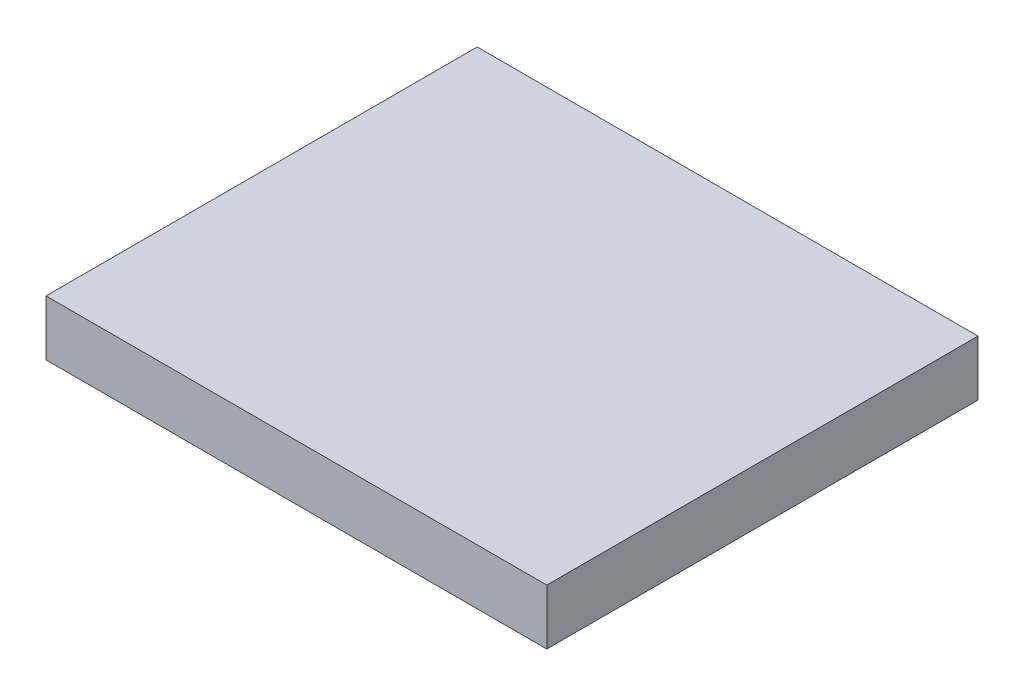
ISO-10303-21;
HEADER;
FILE_DESCRIPTION(('STEP AP214'),'2;1');
FILE_NAME('part.step','',(''),(''),'','','');
FILE_SCHEMA(('AUTOMOTIVE_DESIGN { 1 0 10303 214 1 1 1 1 }'));
ENDSEC;
DATA;
#1=APPLICATION_CONTEXT('core data for automotive mechanical design processes');
#2=APPLICATION_PROTOCOL_DEFINITION('international standard','automotive_design',2000,#1);
#3=PRODUCT_CONTEXT('',#1,'mechanical');
#4=PRODUCT('Part','Part','',(#3));
#5=PRODUCT_RELATED_PRODUCT_CATEGORY('part','',(#4));
#6=PRODUCT_DEFINITION_FORMATION('','',#4);
#7=PRODUCT_DEFINITION_CONTEXT('part definition',#1,'design');
#8=PRODUCT_DEFINITION('design','',#6,#7);
#9=PRODUCT_DEFINITION_SHAPE('','',#8);
#10=(LENGTH_UNIT() NAMED_UNIT(*) SI_UNIT(.MILLI.,.METRE.));
#11=(NAMED_UNIT(*) PLANE_ANGLE_UNIT() SI_UNIT($,.RADIAN.));
#12=(NAMED_UNIT(*) SI_UNIT($,.STERADIAN.) SOLID_ANGLE_UNIT());
#13=UNCERTAINTY_MEASURE_WITH_UNIT(LENGTH_MEASURE(1.E-05),#10,'distance_accuracy_value','');
#14=(GEOMETRIC_REPRESENTATION_CONTEXT(3) GLOBAL_UNCERTAINTY_ASSIGNED_CONTEXT((#13)) GLOBAL_UNIT_ASSIGNED_CONTEXT((#10,
#11,#12)) REPRESENTATION_CONTEXT('',''));
#15=CARTESIAN_POINT('',(0.,0.,0.));
#16=DIRECTION('',(0.,0.,1.));
#17=DIRECTION('',(1.,0.,0.));
#18=AXIS2_PLACEMENT_3D('',#15,#16,#17);
#19=CARTESIAN_POINT('',(-26.199029290648,5.874618009437,0.));
#20=DIRECTION('',(1.,0.,0.));
#21=DIRECTION('',(0.,1.,0.));
#22=AXIS2_PLACEMENT_3D('',#19,#20,#21);
#23=PLANE('',#22);
#24=DIRECTION('',(0.,-1.,0.));
#25=VECTOR('',#24,1.);
#26=CARTESIAN_POINT('',(-26.199029290648,5.887465362914,0.));
#27=LINE('',#26,#25);
#28=CARTESIAN_POINT('',(-26.199029290648,5.887465362914,0.));
#29=VERTEX_POINT('',#28);
#30=CARTESIAN_POINT('',(-26.199029290648,5.874618009437,0.));
#31=VERTEX_POINT('',#30);
#32=EDGE_CURVE('E11',#29,#31,#27,.T.);
#33=ORIENTED_EDGE('',*,*,#32,.F.);
#34=DIRECTION('',(0.,0.,1.));
#35=VECTOR('',#34,1.);
#36=CARTESIAN_POINT('',(-26.199029290648,5.887465362914,0.));
#37=LINE('',#36,#35);
#38=CARTESIAN_POINT('',(-26.199029290648,5.887465362914,0.1));
#39=VERTEX_POINT('',#38);
#40=EDGE_CURVE('E24',#29,#39,#37,.T.);
#41=ORIENTED_EDGE('',*,*,#40,.T.);
#42=DIRECTION('',(0.,1.,0.));
#43=VECTOR('',#42,1.);
#44=CARTESIAN_POINT('',(-26.199029290648,5.887465362914,0.1));
#45=LINE('',#44,#43);
#46=CARTESIAN_POINT('',(-26.199029290648,5.874618009437,0.1));
#47=VERTEX_POINT('',#46);
#48=EDGE_CURVE('E75',#47,#39,#45,.T.);
#49=ORIENTED_EDGE('',*,*,#48,.F.);
#50=DIRECTION('',(0.,0.,1.));
#51=VECTOR('',#50,1.);
#52=CARTESIAN_POINT('',(-26.199029290648,5.874618009437,0.));
#53=LINE('',#52,#51);
#54=EDGE_CURVE('E85',#31,#47,#53,.T.);
#55=ORIENTED_EDGE('',*,*,#54,.F.);
#56=EDGE_LOOP('',(#33,#41,#49,#55));
#57=FACE_BOUND('',#56,.T.);
#58=ADVANCED_FACE('F17',(#57),#23,.T.);
#59=CARTESIAN_POINT('',(-26.315170054864,5.874618009437,0.));
#60=DIRECTION('',(0.,-1.,0.));
#61=DIRECTION('',(1.,0.,0.));
#62=AXIS2_PLACEMENT_3D('',#59,#60,#61);
#63=PLANE('',#62);
#64=DIRECTION('',(-1.,0.,0.));
#65=VECTOR('',#64,1.);
#66=CARTESIAN_POINT('',(-26.199029290648,5.874618009437,0.));
#67=LINE('',#66,#65);
#68=CARTESIAN_POINT('',(-26.315170054864,5.874618009437,0.));
#69=VERTEX_POINT('',#68);
#70=EDGE_CURVE('E83',#31,#69,#67,.T.);
#71=ORIENTED_EDGE('',*,*,#70,.F.);
#72=ORIENTED_EDGE('',*,*,#54,.T.);
#73=DIRECTION('',(1.,0.,0.));
#74=VECTOR('',#73,1.);
#75=CARTESIAN_POINT('',(-26.199029290648,5.874618009437,0.1));
#76=LINE('',#75,#74);
#77=CARTESIAN_POINT('',(-26.315170054864,5.874618009437,0.1));
#78=VERTEX_POINT('',#77);
#79=EDGE_CURVE('E81',#78,#47,#76,.T.);
#80=ORIENTED_EDGE('',*,*,#79,.F.);
#81=DIRECTION('',(0.,0.,1.));
#82=VECTOR('',#81,1.);
#83=CARTESIAN_POINT('',(-26.315170054864,5.874618009437,0.));
#84=LINE('',#83,#82);
#85=EDGE_CURVE('E61',#69,#78,#84,.T.);
#86=ORIENTED_EDGE('',*,*,#85,.F.);
#87=EDGE_LOOP('',(#71,#72,#80,#86));
#88=FACE_BOUND('',#87,.T.);
#89=ADVANCED_FACE('F91',(#88),#63,.T.);
#90=CARTESIAN_POINT('',(-26.315170054864,5.887465362914,0.));
#91=DIRECTION('',(-1.,0.,0.));
#92=DIRECTION('',(0.,-1.,0.));
#93=AXIS2_PLACEMENT_3D('',#90,#91,#92);
#94=PLANE('',#93);
#95=DIRECTION('',(0.,1.,0.));
#96=VECTOR('',#95,1.);
#97=CARTESIAN_POINT('',(-26.315170054864,5.874618009437,0.));
#98=LINE('',#97,#96);
#99=CARTESIAN_POINT('',(-26.315170054864,5.887465362914,0.));
#100=VERTEX_POINT('',#99);
#101=EDGE_CURVE('E65',#69,#100,#98,.T.);
#102=ORIENTED_EDGE('',*,*,#101,.F.);
#103=ORIENTED_EDGE('',*,*,#85,.T.);
#104=DIRECTION('',(0.,-1.,0.));
#105=VECTOR('',#104,1.);
#106=CARTESIAN_POINT('',(-26.315170054864,5.874618009437,0.1));
#107=LINE('',#106,#105);
#108=CARTESIAN_POINT('',(-26.315170054864,5.887465362914,0.1));
#109=VERTEX_POINT('',#108);
#110=EDGE_CURVE('E54',#109,#78,#107,.T.);
#111=ORIENTED_EDGE('',*,*,#110,.F.);
#112=DIRECTION('',(0.,0.,1.));
#113=VECTOR('',#112,1.);
#114=CARTESIAN_POINT('',(-26.315170054864,5.887465362914,0.));
#115=LINE('',#114,#113);
#116=EDGE_CURVE('E58',#100,#109,#115,.T.);
#117=ORIENTED_EDGE('',*,*,#116,.F.);
#118=EDGE_LOOP('',(#102,#103,#111,#117));
#119=FACE_BOUND('',#118,.T.);
#120=ADVANCED_FACE('F57',(#119),#94,.T.);
#121=CARTESIAN_POINT('',(-26.199029290648,5.887465362914,0.));
#122=DIRECTION('',(0.,1.,0.));
#123=DIRECTION('',(-1.,0.,0.));
#124=AXIS2_PLACEMENT_3D('',#121,#122,#123);
#125=PLANE('',#124);
#126=DIRECTION('',(1.,0.,0.));
#127=VECTOR('',#126,1.);
#128=CARTESIAN_POINT('',(-26.315170054864,5.887465362914,0.));
#129=LINE('',#128,#127);
#130=EDGE_CURVE('E71',#100,#29,#129,.T.);
#131=ORIENTED_EDGE('',*,*,#130,.F.);
#132=ORIENTED_EDGE('',*,*,#116,.T.);
#133=DIRECTION('',(-1.,0.,0.));
#134=VECTOR('',#133,1.);
#135=CARTESIAN_POINT('',(-26.315170054864,5.887465362914,0.1));
#136=LINE('',#135,#134);
#137=EDGE_CURVE('E70',#39,#109,#136,.T.);
#138=ORIENTED_EDGE('',*,*,#137,.F.);
#139=ORIENTED_EDGE('',*,*,#40,.F.);
#140=EDGE_LOOP('',(#131,#132,#138,#139));
#141=FACE_BOUND('',#140,.T.);
#142=ADVANCED_FACE('F69',(#141),#125,.T.);
#143=CARTESIAN_POINT('',(-26.257099672756,5.881041686176,0.));
#144=DIRECTION('',(0.,0.,1.));
#145=DIRECTION('',(1.,0.,0.));
#146=AXIS2_PLACEMENT_3D('',#143,#144,#145);
#147=PLANE('',#146);
#148=ORIENTED_EDGE('',*,*,#130,.T.);
#149=ORIENTED_EDGE('',*,*,#32,.T.);
#150=ORIENTED_EDGE('',*,*,#70,.T.);
#151=ORIENTED_EDGE('',*,*,#101,.T.);
#152=EDGE_LOOP('',(#148,#149,#150,#151));
#153=FACE_BOUND('',#152,.T.);
#154=ADVANCED_FACE('F88',(#153),#147,.F.);
#155=CARTESIAN_POINT('',(-26.257099672756,5.881041686176,0.1));
#156=DIRECTION('',(0.,0.,1.));
#157=DIRECTION('',(1.,0.,0.));
#158=AXIS2_PLACEMENT_3D('',#155,#156,#157);
#159=PLANE('',#158);
#160=ORIENTED_EDGE('',*,*,#137,.T.);
#161=ORIENTED_EDGE('',*,*,#110,.T.);
#162=ORIENTED_EDGE('',*,*,#79,.T.);
#163=ORIENTED_EDGE('',*,*,#48,.T.);
#164=EDGE_LOOP('',(#160,#161,#162,#163));
#165=FACE_BOUND('',#164,.T.);
#166=ADVANCED_FACE('F74',(#165),#159,.T.);
#167=CLOSED_SHELL('',(#58,#89,#120,#142,#154,#166));
#168=MANIFOLD_SOLID_BREP('B1',#167);
#169=ADVANCED_BREP_SHAPE_REPRESENTATION('',(#18,#168),#14);
#170=SHAPE_DEFINITION_REPRESENTATION(#9,#169);
ENDSEC;
END-ISO-10303-21;
